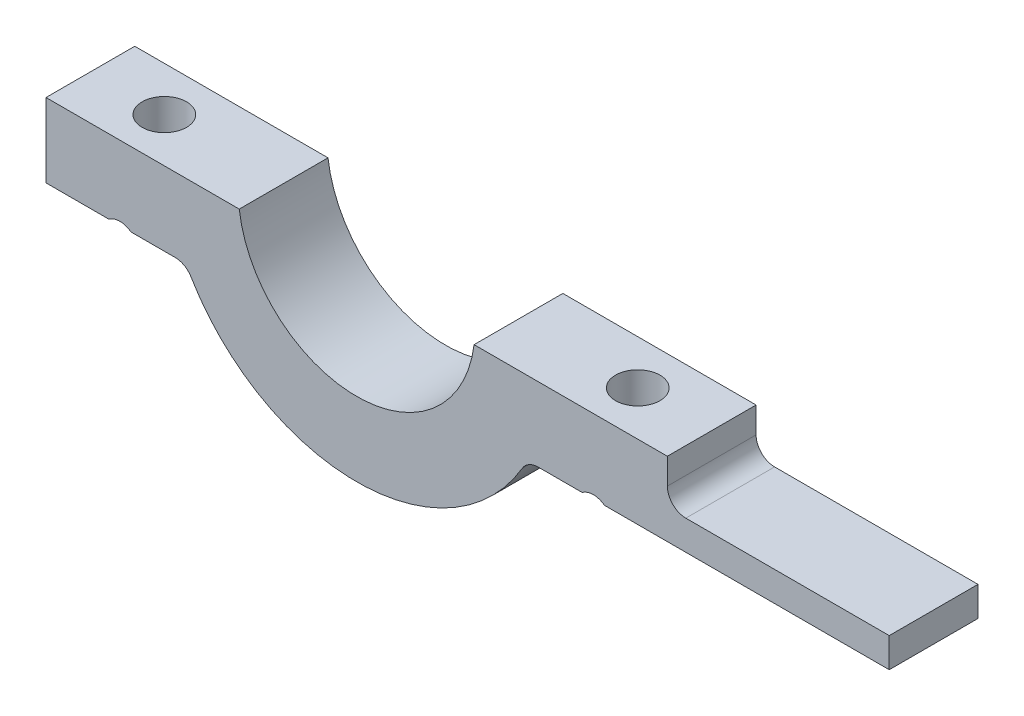
ISO-10303-21;
HEADER;
FILE_DESCRIPTION(('STEP AP214'),'2;1');
FILE_NAME('part.step','',(''),(''),'','','');
FILE_SCHEMA(('AUTOMOTIVE_DESIGN { 1 0 10303 214 1 1 1 1 }'));
ENDSEC;
DATA;
#1=APPLICATION_CONTEXT('core data for automotive mechanical design processes');
#2=APPLICATION_PROTOCOL_DEFINITION('international standard','automotive_design',2000,#1);
#3=PRODUCT_CONTEXT('',#1,'mechanical');
#4=PRODUCT('Part','Part','',(#3));
#5=PRODUCT_RELATED_PRODUCT_CATEGORY('part','',(#4));
#6=PRODUCT_DEFINITION_FORMATION('','',#4);
#7=PRODUCT_DEFINITION_CONTEXT('part definition',#1,'design');
#8=PRODUCT_DEFINITION('design','',#6,#7);
#9=PRODUCT_DEFINITION_SHAPE('','',#8);
#10=(LENGTH_UNIT() NAMED_UNIT(*) SI_UNIT(.MILLI.,.METRE.));
#11=(NAMED_UNIT(*) PLANE_ANGLE_UNIT() SI_UNIT($,.RADIAN.));
#12=(NAMED_UNIT(*) SI_UNIT($,.STERADIAN.) SOLID_ANGLE_UNIT());
#13=UNCERTAINTY_MEASURE_WITH_UNIT(LENGTH_MEASURE(1.E-05),#10,'distance_accuracy_value','');
#14=(GEOMETRIC_REPRESENTATION_CONTEXT(3) GLOBAL_UNCERTAINTY_ASSIGNED_CONTEXT((#13)) GLOBAL_UNIT_ASSIGNED_CONTEXT((#10,
#11,#12)) REPRESENTATION_CONTEXT('',''));
#15=CARTESIAN_POINT('',(0.,0.,0.));
#16=DIRECTION('',(0.,0.,1.));
#17=DIRECTION('',(1.,0.,0.));
#18=AXIS2_PLACEMENT_3D('',#15,#16,#17);
#19=CARTESIAN_POINT('',(16.,-7.,3.));
#20=DIRECTION('',(0.,0.,-1.));
#21=DIRECTION('',(-1.,0.,0.));
#22=AXIS2_PLACEMENT_3D('',#19,#20,#21);
#23=CYLINDRICAL_SURFACE('',#22,1.25);
#24=DIRECTION('',(0.,0.,-1.));
#25=VECTOR('',#24,1.);
#26=CARTESIAN_POINT('',(16.75,-6.,3.));
#27=LINE('',#26,#25);
#28=CARTESIAN_POINT('',(16.75,-6.,-1.29903810567665));
#29=VERTEX_POINT('',#28);
#30=CARTESIAN_POINT('',(16.75,-6.,-3.));
#31=VERTEX_POINT('',#30);
#32=EDGE_CURVE('E237',#29,#31,#27,.T.);
#33=ORIENTED_EDGE('',*,*,#32,.F.);
#34=CARTESIAN_POINT('',(16.75,-6.,-1.29903810567665));
#35=CARTESIAN_POINT('',(16.7034523990835,-5.96505773759994,-1.3259637600243));
#36=CARTESIAN_POINT('',(16.6536803872957,-5.93284701140208,-1.35130751097385));
#37=CARTESIAN_POINT('',(16.5480263148139,-5.87491645200976,-1.39749235477212));
#38=CARTESIAN_POINT('',(16.4920993025307,-5.8492496291699,-1.41829648962166));
#39=CARTESIAN_POINT('',(16.3748736403689,-5.80589259637046,-1.45369899215834));
#40=CARTESIAN_POINT('',(16.3135443763136,-5.78825187196965,-1.46825882938237));
#41=CARTESIAN_POINT('',(16.187803753275,-5.76253392775033,-1.48955289888847));
#42=CARTESIAN_POINT('',(16.1234054666696,-5.75441936271169,-1.49631768800948));
#43=CARTESIAN_POINT('',(16.0015030271869,-5.74869151482896,-1.50109033477879));
#44=CARTESIAN_POINT('',(15.944085875955,-5.74994812580208,-1.50004060489498));
#45=CARTESIAN_POINT('',(15.8304119342341,-5.76024289315279,-1.49147218328509));
#46=CARTESIAN_POINT('',(15.7741559843428,-5.76928649731826,-1.48394896270121));
#47=CARTESIAN_POINT('',(15.6669000244321,-5.79399700567411,-1.4635223484774));
#48=CARTESIAN_POINT('',(15.615777559287,-5.80935223027445,-1.45087248377396));
#49=CARTESIAN_POINT('',(15.5170371491128,-5.84586853244919,-1.4210588648522));
#50=CARTESIAN_POINT('',(15.4694210378669,-5.86703262102421,-1.4038927698564));
#51=CARTESIAN_POINT('',(15.3928862810774,-5.90677749716897,-1.37205772028725));
#52=CARTESIAN_POINT('',(15.3628537191617,-5.92402390487049,-1.3583427136007));
#53=CARTESIAN_POINT('',(15.3048796017577,-5.96054102676911,-1.32960548334226));
#54=CARTESIAN_POINT('',(15.2769309005037,-5.97980422150884,-1.31458814902116));
#55=CARTESIAN_POINT('',(15.25,-5.99999999999997,-1.29903810567669));
#56=B_SPLINE_CURVE_WITH_KNOTS('',3,(#34,#35,#36,#37,#38,#39,#40,#41,#42,#43,#44,#45,#46,#47,#48,
#49,#50,#51,#52,#53,#54,#55),.UNSPECIFIED.,.F.,.F.,(4,2,2,2,2,2,2,2,2,2,4),(0.,
0.192524806168671,0.386562911512205,0.581781680161196,0.77623255330663,0.947648909029573,
1.11918528532624,1.283110600635,1.44712104694824,1.55874051445253,1.66995771337883),.UNSPECIFIED.);
#57=CARTESIAN_POINT('',(15.25,-5.99999999999997,-1.29903810567669));
#58=VERTEX_POINT('',#57);
#59=EDGE_CURVE('E288',#29,#58,#56,.T.);
#60=ORIENTED_EDGE('',*,*,#59,.T.);
#61=DIRECTION('',(0.,0.,-1.));
#62=VECTOR('',#61,1.);
#63=CARTESIAN_POINT('',(15.25,-6.,3.));
#64=LINE('',#63,#62);
#65=CARTESIAN_POINT('',(15.25,-6.,-3.));
#66=VERTEX_POINT('',#65);
#67=EDGE_CURVE('E241',#58,#66,#64,.T.);
#68=ORIENTED_EDGE('',*,*,#67,.T.);
#69=CARTESIAN_POINT('',(16.,-7.,-3.));
#70=DIRECTION('',(0.,0.,1.));
#71=DIRECTION('',(1.,0.,0.));
#72=AXIS2_PLACEMENT_3D('',#69,#70,#71);
#73=CIRCLE('',#72,1.25);
#74=EDGE_CURVE('E341',#66,#31,#73,.F.);
#75=ORIENTED_EDGE('',*,*,#74,.T.);
#76=EDGE_LOOP('',(#33,#60,#68,#75));
#77=FACE_BOUND('',#76,.T.);
#78=ADVANCED_FACE('F35',(#77),#23,.F.);
#79=CARTESIAN_POINT('',(-16.,-7.,3.));
#80=DIRECTION('',(0.,0.,-1.));
#81=DIRECTION('',(-1.,0.,0.));
#82=AXIS2_PLACEMENT_3D('',#79,#80,#81);
#83=CYLINDRICAL_SURFACE('',#82,1.25);
#84=CARTESIAN_POINT('',(-15.25,-6.,1.29903810567665));
#85=CARTESIAN_POINT('',(-15.2965476009165,-5.96505773759994,1.3259637600243));
#86=CARTESIAN_POINT('',(-15.3463196127043,-5.93284701140209,1.35130751097384));
#87=CARTESIAN_POINT('',(-15.4519736851861,-5.87491645200976,1.39749235477212));
#88=CARTESIAN_POINT('',(-15.5079006974693,-5.8492496291699,1.41829648962166));
#89=CARTESIAN_POINT('',(-15.6251263596311,-5.80589259637046,1.45369899215833));
#90=CARTESIAN_POINT('',(-15.6864556236864,-5.78825187196965,1.46825882938237));
#91=CARTESIAN_POINT('',(-15.812196246725,-5.76253392775033,1.48955289888847));
#92=CARTESIAN_POINT('',(-15.8765945333304,-5.75441936271169,1.49631768800948));
#93=CARTESIAN_POINT('',(-15.9984969728131,-5.74869151482896,1.50109033477879));
#94=CARTESIAN_POINT('',(-16.055914124045,-5.74994812580208,1.50004060489498));
#95=CARTESIAN_POINT('',(-16.1695880657659,-5.76024289315279,1.49147218328509));
#96=CARTESIAN_POINT('',(-16.2258440156572,-5.76928649731826,1.48394896270121));
#97=CARTESIAN_POINT('',(-16.3330999755679,-5.79399700567412,1.4635223484774));
#98=CARTESIAN_POINT('',(-16.384222440713,-5.80935223027445,1.45087248377396));
#99=CARTESIAN_POINT('',(-16.4829628508872,-5.84586853244919,1.4210588648522));
#100=CARTESIAN_POINT('',(-16.5305789621331,-5.86703262102422,1.4038927698564));
#101=CARTESIAN_POINT('',(-16.6071137189227,-5.90677749716897,1.37205772028725));
#102=CARTESIAN_POINT('',(-16.6371462808383,-5.9240239048705,1.3583427136007));
#103=CARTESIAN_POINT('',(-16.6951203982423,-5.96054102676912,1.32960548334225));
#104=CARTESIAN_POINT('',(-16.7230690994963,-5.97980422150886,1.31458814902114));
#105=CARTESIAN_POINT('',(-16.75,-6.,1.29903810567667));
#106=B_SPLINE_CURVE_WITH_KNOTS('',3,(#84,#85,#86,#87,#88,#89,#90,#91,#92,#93,#94,#95,#96,#97,
#98,#99,#100,#101,#102,#103,#104,#105),.UNSPECIFIED.,.F.,.F.,(4,2,2,2,2,2,2,2,2,2,4),(0.,
0.192524806168674,0.386562911512207,0.581781680161196,0.77623255330663,0.947648909029573,
1.11918528532624,1.283110600635,1.44712104694824,1.55874051445255,1.66995771337888),.UNSPECIFIED.);
#107=CARTESIAN_POINT('',(-15.25,-6.00000000000003,1.29903810567662));
#108=VERTEX_POINT('',#107);
#109=CARTESIAN_POINT('',(-16.75,-6.00000000000003,1.29903810567664));
#110=VERTEX_POINT('',#109);
#111=EDGE_CURVE('E253',#108,#110,#106,.T.);
#112=ORIENTED_EDGE('',*,*,#111,.F.);
#113=DIRECTION('',(0.,0.,-1.));
#114=VECTOR('',#113,1.);
#115=CARTESIAN_POINT('',(-15.25,-6.,3.));
#116=LINE('',#115,#114);
#117=CARTESIAN_POINT('',(-15.25,-6.,3.));
#118=VERTEX_POINT('',#117);
#119=EDGE_CURVE('E217',#118,#108,#116,.T.);
#120=ORIENTED_EDGE('',*,*,#119,.F.);
#121=CARTESIAN_POINT('',(-16.,-7.,3.));
#122=DIRECTION('',(0.,0.,1.));
#123=DIRECTION('',(1.,0.,0.));
#124=AXIS2_PLACEMENT_3D('',#121,#122,#123);
#125=CIRCLE('',#124,1.25);
#126=CARTESIAN_POINT('',(-16.75,-6.,3.));
#127=VERTEX_POINT('',#126);
#128=EDGE_CURVE('E397',#118,#127,#125,.T.);
#129=ORIENTED_EDGE('',*,*,#128,.T.);
#130=DIRECTION('',(0.,0.,-1.));
#131=VECTOR('',#130,1.);
#132=CARTESIAN_POINT('',(-16.75,-6.,3.));
#133=LINE('',#132,#131);
#134=EDGE_CURVE('E222',#127,#110,#133,.T.);
#135=ORIENTED_EDGE('',*,*,#134,.T.);
#136=EDGE_LOOP('',(#112,#120,#129,#135));
#137=FACE_BOUND('',#136,.T.);
#138=ADVANCED_FACE('F317',(#137),#83,.F.);
#139=CARTESIAN_POINT('',(0.,-6.,3.));
#140=DIRECTION('',(0.,1.,0.));
#141=DIRECTION('',(0.,0.,1.));
#142=AXIS2_PLACEMENT_3D('',#139,#140,#141);
#143=PLANE('',#142);
#144=DIRECTION('',(1.,0.,0.));
#145=VECTOR('',#144,1.);
#146=CARTESIAN_POINT('',(0.,-6.,-3.));
#147=LINE('',#146,#145);
#148=CARTESIAN_POINT('',(-15.25,-6.,-3.));
#149=VERTEX_POINT('',#148);
#150=CARTESIAN_POINT('',(-12.2678441463853,-6.,-3.));
#151=VERTEX_POINT('',#150);
#152=EDGE_CURVE('E295',#149,#151,#147,.T.);
#153=ORIENTED_EDGE('',*,*,#152,.T.);
#154=DIRECTION('',(0.,0.,1.));
#155=VECTOR('',#154,1.);
#156=CARTESIAN_POINT('',(-12.2678441463853,-6.,3.));
#157=LINE('',#156,#155);
#158=CARTESIAN_POINT('',(-12.2678441463853,-6.,3.));
#159=VERTEX_POINT('',#158);
#160=EDGE_CURVE('E425',#151,#159,#157,.T.);
#161=ORIENTED_EDGE('',*,*,#160,.T.);
#162=DIRECTION('',(1.,0.,0.));
#163=VECTOR('',#162,1.);
#164=CARTESIAN_POINT('',(0.,-6.,3.));
#165=LINE('',#164,#163);
#166=EDGE_CURVE('E216',#118,#159,#165,.T.);
#167=ORIENTED_EDGE('',*,*,#166,.F.);
#168=ORIENTED_EDGE('',*,*,#119,.T.);
#169=CARTESIAN_POINT('',(-16.,-6.00000000000003,0.));
#170=DIRECTION('',(0.,-1.,0.));
#171=DIRECTION('',(1.,0.,0.));
#172=AXIS2_PLACEMENT_3D('',#169,#170,#171);
#173=CIRCLE('',#172,1.5);
#174=CARTESIAN_POINT('',(-15.25,-6.00000000000003,-1.29903810567662));
#175=VERTEX_POINT('',#174);
#176=EDGE_CURVE('E358',#175,#108,#173,.T.);
#177=ORIENTED_EDGE('',*,*,#176,.F.);
#178=EDGE_CURVE('E221',#175,#149,#116,.T.);
#179=ORIENTED_EDGE('',*,*,#178,.T.);
#180=EDGE_LOOP('',(#153,#161,#167,#168,#177,#179));
#181=FACE_BOUND('',#180,.T.);
#182=ADVANCED_FACE('F313',(#181),#143,.F.);
#183=CARTESIAN_POINT('',(0.,0.,3.));
#184=DIRECTION('',(0.,0.,-1.));
#185=DIRECTION('',(-1.,0.,0.));
#186=AXIS2_PLACEMENT_3D('',#183,#184,#185);
#187=CYLINDRICAL_SURFACE('',#186,13.);
#188=CARTESIAN_POINT('',(0.,0.,3.));
#189=DIRECTION('',(0.,0.,1.));
#190=DIRECTION('',(1.,0.,0.));
#191=AXIS2_PLACEMENT_3D('',#188,#189,#190);
#192=CIRCLE('',#191,13.);
#193=CARTESIAN_POINT('',(-11.1917174668778,-6.6140350877193,3.));
#194=VERTEX_POINT('',#193);
#195=CARTESIAN_POINT('',(11.1917174668778,-6.6140350877193,3.));
#196=VERTEX_POINT('',#195);
#197=EDGE_CURVE('E437',#194,#196,#192,.T.);
#198=ORIENTED_EDGE('',*,*,#197,.F.);
#199=DIRECTION('',(0.,0.,-1.));
#200=VECTOR('',#199,1.);
#201=CARTESIAN_POINT('',(-11.1917174668778,-6.6140350877193,3.));
#202=LINE('',#201,#200);
#203=CARTESIAN_POINT('',(-11.1917174668778,-6.6140350877193,-3.));
#204=VERTEX_POINT('',#203);
#205=EDGE_CURVE('E424',#194,#204,#202,.T.);
#206=ORIENTED_EDGE('',*,*,#205,.T.);
#207=CARTESIAN_POINT('',(0.,0.,-3.));
#208=DIRECTION('',(0.,0.,1.));
#209=DIRECTION('',(1.,0.,0.));
#210=AXIS2_PLACEMENT_3D('',#207,#208,#209);
#211=CIRCLE('',#210,13.);
#212=CARTESIAN_POINT('',(11.1917174668778,-6.6140350877193,-3.));
#213=VERTEX_POINT('',#212);
#214=EDGE_CURVE('E402',#204,#213,#211,.T.);
#215=ORIENTED_EDGE('',*,*,#214,.T.);
#216=DIRECTION('',(0.,0.,-1.));
#217=VECTOR('',#216,1.);
#218=CARTESIAN_POINT('',(11.1917174668778,-6.6140350877193,3.));
#219=LINE('',#218,#217);
#220=EDGE_CURVE('E421',#213,#196,#219,.F.);
#221=ORIENTED_EDGE('',*,*,#220,.T.);
#222=EDGE_LOOP('',(#198,#206,#215,#221));
#223=FACE_BOUND('',#222,.T.);
#224=ADVANCED_FACE('F309',(#223),#187,.T.);
#225=CARTESIAN_POINT('',(0.,-6.,3.));
#226=DIRECTION('',(0.,1.,0.));
#227=DIRECTION('',(-1.,0.,0.));
#228=AXIS2_PLACEMENT_3D('',#225,#226,#227);
#229=PLANE('',#228);
#230=DIRECTION('',(1.,0.,0.));
#231=VECTOR('',#230,1.);
#232=CARTESIAN_POINT('',(0.,-6.,3.));
#233=LINE('',#232,#231);
#234=CARTESIAN_POINT('',(12.2678441463853,-6.,3.));
#235=VERTEX_POINT('',#234);
#236=CARTESIAN_POINT('',(15.25,-6.,3.));
#237=VERTEX_POINT('',#236);
#238=EDGE_CURVE('E382',#235,#237,#233,.T.);
#239=ORIENTED_EDGE('',*,*,#238,.F.);
#240=DIRECTION('',(0.,0.,1.));
#241=VECTOR('',#240,1.);
#242=CARTESIAN_POINT('',(12.2678441463853,-6.,-3.));
#243=LINE('',#242,#241);
#244=CARTESIAN_POINT('',(12.2678441463853,-6.,-3.));
#245=VERTEX_POINT('',#244);
#246=EDGE_CURVE('E412',#235,#245,#243,.F.);
#247=ORIENTED_EDGE('',*,*,#246,.T.);
#248=DIRECTION('',(1.,0.,0.));
#249=VECTOR('',#248,1.);
#250=CARTESIAN_POINT('',(0.,-6.,-3.));
#251=LINE('',#250,#249);
#252=EDGE_CURVE('E405',#245,#66,#251,.T.);
#253=ORIENTED_EDGE('',*,*,#252,.T.);
#254=ORIENTED_EDGE('',*,*,#67,.F.);
#255=CARTESIAN_POINT('',(16.,-5.99999999999997,0.));
#256=DIRECTION('',(0.,-1.,0.));
#257=DIRECTION('',(1.,0.,0.));
#258=AXIS2_PLACEMENT_3D('',#255,#256,#257);
#259=CIRCLE('',#258,1.5);
#260=CARTESIAN_POINT('',(15.25,-5.99999999999997,1.29903810567669));
#261=VERTEX_POINT('',#260);
#262=EDGE_CURVE('E351',#261,#58,#259,.T.);
#263=ORIENTED_EDGE('',*,*,#262,.F.);
#264=EDGE_CURVE('E242',#237,#261,#64,.T.);
#265=ORIENTED_EDGE('',*,*,#264,.F.);
#266=EDGE_LOOP('',(#239,#247,#253,#254,#263,#265));
#267=FACE_BOUND('',#266,.T.);
#268=ADVANCED_FACE('F303',(#267),#229,.F.);
#269=ORIENTED_EDGE('',*,*,#264,.T.);
#270=CARTESIAN_POINT('',(15.25,-6.,1.29903810567667));
#271=CARTESIAN_POINT('',(15.2965476009165,-5.96505773759994,1.32596376002432));
#272=CARTESIAN_POINT('',(15.3463196127043,-5.93284701140208,1.35130751097386));
#273=CARTESIAN_POINT('',(15.4519736851861,-5.87491645200976,1.39749235477213));
#274=CARTESIAN_POINT('',(15.5079006974693,-5.8492496291699,1.41829648962167));
#275=CARTESIAN_POINT('',(15.6251263596311,-5.80589259637046,1.45369899215834));
#276=CARTESIAN_POINT('',(15.6864556236864,-5.78825187196965,1.46825882938237));
#277=CARTESIAN_POINT('',(15.812196246725,-5.76253392775033,1.48955289888848));
#278=CARTESIAN_POINT('',(15.8765945333304,-5.75441936271169,1.49631768800948));
#279=CARTESIAN_POINT('',(15.9984969728131,-5.74869151482896,1.50109033477879));
#280=CARTESIAN_POINT('',(16.055914124045,-5.74994812580208,1.50004060489498));
#281=CARTESIAN_POINT('',(16.1695880657659,-5.76024289315279,1.49147218328509));
#282=CARTESIAN_POINT('',(16.2258440156572,-5.76928649731826,1.4839489627012));
#283=CARTESIAN_POINT('',(16.3330999755679,-5.79399700567411,1.46352234847739));
#284=CARTESIAN_POINT('',(16.384222440713,-5.80935223027445,1.45087248377395));
#285=CARTESIAN_POINT('',(16.4829628508872,-5.84586853244918,1.42105886485219));
#286=CARTESIAN_POINT('',(16.5305789621331,-5.86703262102421,1.40389276985639));
#287=CARTESIAN_POINT('',(16.6071137189226,-5.90677749716896,1.37205772028724));
#288=CARTESIAN_POINT('',(16.6371462808383,-5.92402390487048,1.35834271360069));
#289=CARTESIAN_POINT('',(16.6951203982423,-5.9605410267691,1.32960548334225));
#290=CARTESIAN_POINT('',(16.7230690994963,-5.97980422150883,1.31458814902115));
#291=CARTESIAN_POINT('',(16.75,-5.99999999999996,1.29903810567667));
#292=B_SPLINE_CURVE_WITH_KNOTS('',3,(#270,#271,#272,#273,#274,#275,#276,#277,#278,#279,#280,
#281,#282,#283,#284,#285,#286,#287,#288,#289,#290,#291),.UNSPECIFIED.,.F.,.F.,(4,2,2,2,2,2,2,2,
2,2,4),(0.,0.192524806168671,0.386562911512203,0.581781680161193,0.776232553306623,
0.947648909029566,1.11918528532623,1.28311060063499,1.44712104694823,1.55874051445252,
1.66995771337882),.UNSPECIFIED.);
#293=CARTESIAN_POINT('',(16.75,-5.99999999999997,1.29903810567665));
#294=VERTEX_POINT('',#293);
#295=EDGE_CURVE('E280',#261,#294,#292,.T.);
#296=ORIENTED_EDGE('',*,*,#295,.T.);
#297=CARTESIAN_POINT('',(16.75,-6.,3.));
#298=VERTEX_POINT('',#297);
#299=EDGE_CURVE('E238',#298,#294,#27,.T.);
#300=ORIENTED_EDGE('',*,*,#299,.F.);
#301=CARTESIAN_POINT('',(16.,-7.,3.));
#302=DIRECTION('',(0.,0.,1.));
#303=DIRECTION('',(1.,0.,0.));
#304=AXIS2_PLACEMENT_3D('',#301,#302,#303);
#305=CIRCLE('',#304,1.25);
#306=EDGE_CURVE('E379',#237,#298,#305,.F.);
#307=ORIENTED_EDGE('',*,*,#306,.F.);
#308=EDGE_LOOP('',(#269,#296,#300,#307));
#309=FACE_BOUND('',#308,.T.);
#310=ADVANCED_FACE('F297',(#309),#23,.F.);
#311=CARTESIAN_POINT('',(0.,-5.99999999999999,3.));
#312=DIRECTION('',(0.,1.,0.));
#313=DIRECTION('',(-1.,0.,0.));
#314=AXIS2_PLACEMENT_3D('',#311,#312,#313);
#315=PLANE('',#314);
#316=ORIENTED_EDGE('',*,*,#299,.T.);
#317=EDGE_CURVE('E346',#29,#294,#259,.T.);
#318=ORIENTED_EDGE('',*,*,#317,.F.);
#319=ORIENTED_EDGE('',*,*,#32,.T.);
#320=DIRECTION('',(1.,0.,0.));
#321=VECTOR('',#320,1.);
#322=CARTESIAN_POINT('',(0.,-5.99999999999999,-3.));
#323=LINE('',#322,#321);
#324=CARTESIAN_POINT('',(36.,-6.,-3.));
#325=VERTEX_POINT('',#324);
#326=EDGE_CURVE('E203',#31,#325,#323,.T.);
#327=ORIENTED_EDGE('',*,*,#326,.T.);
#328=DIRECTION('',(0.,0.,-1.));
#329=VECTOR('',#328,1.);
#330=CARTESIAN_POINT('',(36.,-6.,3.));
#331=LINE('',#330,#329);
#332=CARTESIAN_POINT('',(36.,-6.,3.));
#333=VERTEX_POINT('',#332);
#334=EDGE_CURVE('E234',#333,#325,#331,.T.);
#335=ORIENTED_EDGE('',*,*,#334,.F.);
#336=DIRECTION('',(1.,0.,0.));
#337=VECTOR('',#336,1.);
#338=CARTESIAN_POINT('',(0.,-5.99999999999999,3.));
#339=LINE('',#338,#337);
#340=EDGE_CURVE('E378',#298,#333,#339,.T.);
#341=ORIENTED_EDGE('',*,*,#340,.F.);
#342=EDGE_LOOP('',(#316,#318,#319,#327,#335,#341));
#343=FACE_BOUND('',#342,.T.);
#344=ADVANCED_FACE('F302',(#343),#315,.F.);
#345=CARTESIAN_POINT('',(36.,0.,3.));
#346=DIRECTION('',(-1.,0.,0.));
#347=DIRECTION('',(0.,0.,1.));
#348=AXIS2_PLACEMENT_3D('',#345,#346,#347);
#349=PLANE('',#348);
#350=DIRECTION('',(0.,1.,0.));
#351=VECTOR('',#350,1.);
#352=CARTESIAN_POINT('',(36.,0.,-3.));
#353=LINE('',#352,#351);
#354=CARTESIAN_POINT('',(36.,-4.,-3.));
#355=VERTEX_POINT('',#354);
#356=EDGE_CURVE('E198',#325,#355,#353,.T.);
#357=ORIENTED_EDGE('',*,*,#356,.T.);
#358=DIRECTION('',(0.,0.,1.));
#359=VECTOR('',#358,1.);
#360=CARTESIAN_POINT('',(36.,-4.,-3.));
#361=LINE('',#360,#359);
#362=CARTESIAN_POINT('',(36.,-4.,3.));
#363=VERTEX_POINT('',#362);
#364=EDGE_CURVE('E191',#355,#363,#361,.T.);
#365=ORIENTED_EDGE('',*,*,#364,.T.);
#366=DIRECTION('',(0.,1.,0.));
#367=VECTOR('',#366,1.);
#368=CARTESIAN_POINT('',(36.,0.,3.));
#369=LINE('',#368,#367);
#370=EDGE_CURVE('E377',#333,#363,#369,.T.);
#371=ORIENTED_EDGE('',*,*,#370,.F.);
#372=ORIENTED_EDGE('',*,*,#334,.T.);
#373=EDGE_LOOP('',(#357,#365,#371,#372));
#374=FACE_BOUND('',#373,.T.);
#375=ADVANCED_FACE('F376',(#374),#349,.F.);
#376=CARTESIAN_POINT('',(0.,-0.999999999999998,3.));
#377=DIRECTION('',(0.,-1.,0.));
#378=DIRECTION('',(1.,0.,0.));
#379=AXIS2_PLACEMENT_3D('',#376,#377,#378);
#380=PLANE('',#379);
#381=CARTESIAN_POINT('',(16.,-0.999999999999922,0.));
#382=DIRECTION('',(0.,-1.,0.));
#383=DIRECTION('',(1.,0.,0.));
#384=AXIS2_PLACEMENT_3D('',#381,#382,#383);
#385=CIRCLE('',#384,1.5);
#386=CARTESIAN_POINT('',(17.5,-0.999999999999919,0.));
#387=VERTEX_POINT('',#386);
#388=EDGE_CURVE('E352',#387,#387,#385,.T.);
#389=ORIENTED_EDGE('',*,*,#388,.T.);
#390=EDGE_LOOP('',(#389));
#391=FACE_BOUND('',#390,.T.);
#392=DIRECTION('',(-1.,0.,0.));
#393=VECTOR('',#392,1.);
#394=CARTESIAN_POINT('',(0.,-0.999999999999998,3.));
#395=LINE('',#394,#393);
#396=CARTESIAN_POINT('',(21.,-1.,3.));
#397=VERTEX_POINT('',#396);
#398=CARTESIAN_POINT('',(7.93725393319377,-0.999999999999998,3.));
#399=VERTEX_POINT('',#398);
#400=EDGE_CURVE('E190',#397,#399,#395,.T.);
#401=ORIENTED_EDGE('',*,*,#400,.F.);
#402=DIRECTION('',(0.,0.,1.));
#403=VECTOR('',#402,1.);
#404=CARTESIAN_POINT('',(21.,-1.,-3.));
#405=LINE('',#404,#403);
#406=CARTESIAN_POINT('',(21.,-1.,-3.));
#407=VERTEX_POINT('',#406);
#408=EDGE_CURVE('E177',#407,#397,#405,.T.);
#409=ORIENTED_EDGE('',*,*,#408,.F.);
#410=DIRECTION('',(-1.,0.,0.));
#411=VECTOR('',#410,1.);
#412=CARTESIAN_POINT('',(0.,-0.999999999999998,-3.));
#413=LINE('',#412,#411);
#414=CARTESIAN_POINT('',(7.93725393319377,-0.999999999999998,-3.));
#415=VERTEX_POINT('',#414);
#416=EDGE_CURVE('E188',#407,#415,#413,.T.);
#417=ORIENTED_EDGE('',*,*,#416,.T.);
#418=DIRECTION('',(0.,0.,-1.));
#419=VECTOR('',#418,1.);
#420=CARTESIAN_POINT('',(7.93725393319377,-0.999999999999998,3.));
#421=LINE('',#420,#419);
#422=EDGE_CURVE('E232',#399,#415,#421,.T.);
#423=ORIENTED_EDGE('',*,*,#422,.F.);
#424=EDGE_LOOP('',(#401,#409,#417,#423));
#425=FACE_BOUND('',#424,.T.);
#426=ADVANCED_FACE('F186',(#391,#425),#380,.F.);
#427=CARTESIAN_POINT('',(0.,0.,3.));
#428=DIRECTION('',(0.,0.,-1.));
#429=DIRECTION('',(-1.,0.,0.));
#430=AXIS2_PLACEMENT_3D('',#427,#428,#429);
#431=CYLINDRICAL_SURFACE('',#430,8.);
#432=CARTESIAN_POINT('',(0.,0.,-3.));
#433=DIRECTION('',(0.,0.,1.));
#434=DIRECTION('',(1.,0.,0.));
#435=AXIS2_PLACEMENT_3D('',#432,#433,#434);
#436=CIRCLE('',#435,8.);
#437=CARTESIAN_POINT('',(-7.93725393319377,-1.,-3.));
#438=VERTEX_POINT('',#437);
#439=EDGE_CURVE('E197',#438,#415,#436,.T.);
#440=ORIENTED_EDGE('',*,*,#439,.F.);
#441=DIRECTION('',(0.,0.,-1.));
#442=VECTOR('',#441,1.);
#443=CARTESIAN_POINT('',(-7.93725393319377,-1.,3.));
#444=LINE('',#443,#442);
#445=CARTESIAN_POINT('',(-7.93725393319377,-1.,3.));
#446=VERTEX_POINT('',#445);
#447=EDGE_CURVE('E230',#446,#438,#444,.T.);
#448=ORIENTED_EDGE('',*,*,#447,.F.);
#449=CARTESIAN_POINT('',(0.,0.,3.));
#450=DIRECTION('',(0.,0.,1.));
#451=DIRECTION('',(1.,0.,0.));
#452=AXIS2_PLACEMENT_3D('',#449,#450,#451);
#453=CIRCLE('',#452,8.);
#454=EDGE_CURVE('E387',#446,#399,#453,.T.);
#455=ORIENTED_EDGE('',*,*,#454,.T.);
#456=ORIENTED_EDGE('',*,*,#422,.T.);
#457=EDGE_LOOP('',(#440,#448,#455,#456));
#458=FACE_BOUND('',#457,.T.);
#459=ADVANCED_FACE('F468',(#458),#431,.F.);
#460=CARTESIAN_POINT('',(0.,-1.,3.));
#461=DIRECTION('',(0.,1.,0.));
#462=DIRECTION('',(0.,0.,1.));
#463=AXIS2_PLACEMENT_3D('',#460,#461,#462);
#464=PLANE('',#463);
#465=CARTESIAN_POINT('',(-16.,-0.999999999999988,0.));
#466=DIRECTION('',(0.,-1.,0.));
#467=DIRECTION('',(1.,0.,0.));
#468=AXIS2_PLACEMENT_3D('',#465,#466,#467);
#469=CIRCLE('',#468,1.5);
#470=CARTESIAN_POINT('',(-14.5,-0.999999999999985,0.));
#471=VERTEX_POINT('',#470);
#472=EDGE_CURVE('E361',#471,#471,#469,.T.);
#473=ORIENTED_EDGE('',*,*,#472,.T.);
#474=EDGE_LOOP('',(#473));
#475=FACE_BOUND('',#474,.T.);
#476=DIRECTION('',(1.,0.,0.));
#477=VECTOR('',#476,1.);
#478=CARTESIAN_POINT('',(0.,-1.,-3.));
#479=LINE('',#478,#477);
#480=CARTESIAN_POINT('',(-21.,-1.,-3.));
#481=VERTEX_POINT('',#480);
#482=EDGE_CURVE('E200',#481,#438,#479,.T.);
#483=ORIENTED_EDGE('',*,*,#482,.F.);
#484=DIRECTION('',(0.,0.,-1.));
#485=VECTOR('',#484,1.);
#486=CARTESIAN_POINT('',(-21.,-1.,3.));
#487=LINE('',#486,#485);
#488=CARTESIAN_POINT('',(-21.,-1.,3.));
#489=VERTEX_POINT('',#488);
#490=EDGE_CURVE('E228',#489,#481,#487,.T.);
#491=ORIENTED_EDGE('',*,*,#490,.F.);
#492=DIRECTION('',(1.,0.,0.));
#493=VECTOR('',#492,1.);
#494=CARTESIAN_POINT('',(0.,-1.,3.));
#495=LINE('',#494,#493);
#496=EDGE_CURVE('E390',#489,#446,#495,.T.);
#497=ORIENTED_EDGE('',*,*,#496,.T.);
#498=ORIENTED_EDGE('',*,*,#447,.T.);
#499=EDGE_LOOP('',(#483,#491,#497,#498));
#500=FACE_BOUND('',#499,.T.);
#501=ADVANCED_FACE('F465',(#475,#500),#464,.T.);
#502=CARTESIAN_POINT('',(-21.,0.,3.));
#503=DIRECTION('',(1.,0.,0.));
#504=DIRECTION('',(0.,1.,0.));
#505=AXIS2_PLACEMENT_3D('',#502,#503,#504);
#506=PLANE('',#505);
#507=DIRECTION('',(0.,-1.,0.));
#508=VECTOR('',#507,1.);
#509=CARTESIAN_POINT('',(-21.,0.,-3.));
#510=LINE('',#509,#508);
#511=CARTESIAN_POINT('',(-21.,-6.,-3.));
#512=VERTEX_POINT('',#511);
#513=EDGE_CURVE('E208',#481,#512,#510,.T.);
#514=ORIENTED_EDGE('',*,*,#513,.T.);
#515=DIRECTION('',(0.,0.,-1.));
#516=VECTOR('',#515,1.);
#517=CARTESIAN_POINT('',(-21.,-6.,3.));
#518=LINE('',#517,#516);
#519=CARTESIAN_POINT('',(-21.,-6.,3.));
#520=VERTEX_POINT('',#519);
#521=EDGE_CURVE('E225',#520,#512,#518,.T.);
#522=ORIENTED_EDGE('',*,*,#521,.F.);
#523=DIRECTION('',(0.,-1.,0.));
#524=VECTOR('',#523,1.);
#525=CARTESIAN_POINT('',(-21.,0.,3.));
#526=LINE('',#525,#524);
#527=EDGE_CURVE('E393',#489,#520,#526,.T.);
#528=ORIENTED_EDGE('',*,*,#527,.F.);
#529=ORIENTED_EDGE('',*,*,#490,.T.);
#530=EDGE_LOOP('',(#514,#522,#528,#529));
#531=FACE_BOUND('',#530,.T.);
#532=ADVANCED_FACE('F462',(#531),#506,.F.);
#533=CARTESIAN_POINT('',(0.,-6.,3.));
#534=DIRECTION('',(0.,1.,0.));
#535=DIRECTION('',(0.,0.,1.));
#536=AXIS2_PLACEMENT_3D('',#533,#534,#535);
#537=PLANE('',#536);
#538=CARTESIAN_POINT('',(-16.75,-6.,-1.29903810567664));
#539=VERTEX_POINT('',#538);
#540=CARTESIAN_POINT('',(-16.75,-6.,-3.));
#541=VERTEX_POINT('',#540);
#542=EDGE_CURVE('E220',#539,#541,#133,.T.);
#543=ORIENTED_EDGE('',*,*,#542,.F.);
#544=EDGE_CURVE('E360',#110,#539,#173,.T.);
#545=ORIENTED_EDGE('',*,*,#544,.F.);
#546=ORIENTED_EDGE('',*,*,#134,.F.);
#547=DIRECTION('',(1.,0.,0.));
#548=VECTOR('',#547,1.);
#549=CARTESIAN_POINT('',(0.,-6.,3.));
#550=LINE('',#549,#548);
#551=EDGE_CURVE('E395',#520,#127,#550,.T.);
#552=ORIENTED_EDGE('',*,*,#551,.F.);
#553=ORIENTED_EDGE('',*,*,#521,.T.);
#554=DIRECTION('',(1.,0.,0.));
#555=VECTOR('',#554,1.);
#556=CARTESIAN_POINT('',(0.,-6.,-3.));
#557=LINE('',#556,#555);
#558=EDGE_CURVE('E210',#512,#541,#557,.T.);
#559=ORIENTED_EDGE('',*,*,#558,.T.);
#560=EDGE_LOOP('',(#543,#545,#546,#552,#553,#559));
#561=FACE_BOUND('',#560,.T.);
#562=ADVANCED_FACE('F455',(#561),#537,.F.);
#563=CARTESIAN_POINT('',(-16.75,-6.,-1.29903810567667));
#564=CARTESIAN_POINT('',(-16.7034523990835,-5.96505773759994,-1.32596376002432));
#565=CARTESIAN_POINT('',(-16.6536803872957,-5.93284701140209,-1.35130751097386));
#566=CARTESIAN_POINT('',(-16.5480263148139,-5.87491645200976,-1.39749235477213));
#567=CARTESIAN_POINT('',(-16.4920993025307,-5.84924962916991,-1.41829648962167));
#568=CARTESIAN_POINT('',(-16.3748736403689,-5.80589259637046,-1.45369899215834));
#569=CARTESIAN_POINT('',(-16.3135443763136,-5.78825187196965,-1.46825882938237));
#570=CARTESIAN_POINT('',(-16.187803753275,-5.76253392775033,-1.48955289888848));
#571=CARTESIAN_POINT('',(-16.1234054666696,-5.75441936271169,-1.49631768800948));
#572=CARTESIAN_POINT('',(-16.0015030271869,-5.74869151482896,-1.50109033477879));
#573=CARTESIAN_POINT('',(-15.944085875955,-5.74994812580208,-1.50004060489498));
#574=CARTESIAN_POINT('',(-15.8304119342341,-5.76024289315279,-1.49147218328509));
#575=CARTESIAN_POINT('',(-15.7741559843428,-5.76928649731826,-1.48394896270121));
#576=CARTESIAN_POINT('',(-15.6669000244321,-5.79399700567411,-1.46352234847739));
#577=CARTESIAN_POINT('',(-15.615777559287,-5.80935223027445,-1.45087248377395));
#578=CARTESIAN_POINT('',(-15.5170371491128,-5.84586853244919,-1.42105886485219));
#579=CARTESIAN_POINT('',(-15.4694210378669,-5.86703262102421,-1.40389276985639));
#580=CARTESIAN_POINT('',(-15.3928862810774,-5.90677749716897,-1.37205772028724));
#581=CARTESIAN_POINT('',(-15.3628537191617,-5.9240239048705,-1.35834271360069));
#582=CARTESIAN_POINT('',(-15.3048796017577,-5.96054102676912,-1.32960548334223));
#583=CARTESIAN_POINT('',(-15.2769309005037,-5.97980422150886,-1.31458814902112));
#584=CARTESIAN_POINT('',(-15.25,-6.,-1.29903810567665));
#585=B_SPLINE_CURVE_WITH_KNOTS('',3,(#563,#564,#565,#566,#567,#568,#569,#570,#571,#572,#573,
#574,#575,#576,#577,#578,#579,#580,#581,#582,#583,#584),.UNSPECIFIED.,.F.,.F.,(4,2,2,2,2,2,2,2,
2,2,4),(0.,0.19252480616867,0.386562911512199,0.581781680161189,0.776232553306619,
0.947648909029562,1.11918528532623,1.28311060063499,1.44712104694822,1.55874051445255,
1.66995771337888),.UNSPECIFIED.);
#586=EDGE_CURVE('E245',#539,#175,#585,.T.);
#587=ORIENTED_EDGE('',*,*,#586,.F.);
#588=ORIENTED_EDGE('',*,*,#542,.T.);
#589=CARTESIAN_POINT('',(-16.,-7.,-3.));
#590=DIRECTION('',(0.,0.,1.));
#591=DIRECTION('',(1.,0.,0.));
#592=AXIS2_PLACEMENT_3D('',#589,#590,#591);
#593=CIRCLE('',#592,1.25);
#594=EDGE_CURVE('E213',#149,#541,#593,.T.);
#595=ORIENTED_EDGE('',*,*,#594,.F.);
#596=ORIENTED_EDGE('',*,*,#178,.F.);
#597=EDGE_LOOP('',(#587,#588,#595,#596));
#598=FACE_BOUND('',#597,.T.);
#599=ADVANCED_FACE('F259',(#598),#83,.F.);
#600=CARTESIAN_POINT('',(0.,0.,3.));
#601=DIRECTION('',(0.,0.,1.));
#602=DIRECTION('',(1.,0.,0.));
#603=AXIS2_PLACEMENT_3D('',#600,#601,#602);
#604=PLANE('',#603);
#605=DIRECTION('',(1.,0.,0.));
#606=VECTOR('',#605,1.);
#607=CARTESIAN_POINT('',(36.,-4.,3.));
#608=LINE('',#607,#606);
#609=CARTESIAN_POINT('',(22.25,-4.,3.));
#610=VERTEX_POINT('',#609);
#611=EDGE_CURVE('E182',#610,#363,#608,.T.);
#612=ORIENTED_EDGE('',*,*,#611,.F.);
#613=CARTESIAN_POINT('',(22.25,-2.75,3.));
#614=DIRECTION('',(0.,0.,1.));
#615=DIRECTION('',(1.,0.,0.));
#616=AXIS2_PLACEMENT_3D('',#613,#614,#615);
#617=CIRCLE('',#616,1.25);
#618=CARTESIAN_POINT('',(21.,-2.75,3.));
#619=VERTEX_POINT('',#618);
#620=EDGE_CURVE('E43',#610,#619,#617,.F.);
#621=ORIENTED_EDGE('',*,*,#620,.T.);
#622=DIRECTION('',(0.,-1.,0.));
#623=VECTOR('',#622,1.);
#624=CARTESIAN_POINT('',(21.,-1.,3.));
#625=LINE('',#624,#623);
#626=EDGE_CURVE('E365',#397,#619,#625,.T.);
#627=ORIENTED_EDGE('',*,*,#626,.F.);
#628=ORIENTED_EDGE('',*,*,#400,.T.);
#629=ORIENTED_EDGE('',*,*,#454,.F.);
#630=ORIENTED_EDGE('',*,*,#496,.F.);
#631=ORIENTED_EDGE('',*,*,#527,.T.);
#632=ORIENTED_EDGE('',*,*,#551,.T.);
#633=ORIENTED_EDGE('',*,*,#128,.F.);
#634=ORIENTED_EDGE('',*,*,#166,.T.);
#635=CARTESIAN_POINT('',(-12.2678441463853,-7.25,3.));
#636=DIRECTION('',(0.,0.,1.));
#637=DIRECTION('',(1.,0.,0.));
#638=AXIS2_PLACEMENT_3D('',#635,#636,#637);
#639=CIRCLE('',#638,1.25);
#640=EDGE_CURVE('E417',#159,#194,#639,.F.);
#641=ORIENTED_EDGE('',*,*,#640,.T.);
#642=ORIENTED_EDGE('',*,*,#197,.T.);
#643=CARTESIAN_POINT('',(12.2678441463853,-7.25,3.));
#644=DIRECTION('',(0.,0.,1.));
#645=DIRECTION('',(1.,0.,0.));
#646=AXIS2_PLACEMENT_3D('',#643,#644,#645);
#647=CIRCLE('',#646,1.25);
#648=EDGE_CURVE('E416',#196,#235,#647,.F.);
#649=ORIENTED_EDGE('',*,*,#648,.T.);
#650=ORIENTED_EDGE('',*,*,#238,.T.);
#651=ORIENTED_EDGE('',*,*,#306,.T.);
#652=ORIENTED_EDGE('',*,*,#340,.T.);
#653=ORIENTED_EDGE('',*,*,#370,.T.);
#654=EDGE_LOOP('',(#612,#621,#627,#628,#629,#630,#631,#632,#633,#634,#641,#642,#649,#650,#651,
#652,#653));
#655=FACE_BOUND('',#654,.T.);
#656=ADVANCED_FACE('F277',(#655),#604,.T.);
#657=CARTESIAN_POINT('',(0.,0.,-3.));
#658=DIRECTION('',(0.,0.,1.));
#659=DIRECTION('',(1.,0.,0.));
#660=AXIS2_PLACEMENT_3D('',#657,#658,#659);
#661=PLANE('',#660);
#662=DIRECTION('',(0.,-1.,0.));
#663=VECTOR('',#662,1.);
#664=CARTESIAN_POINT('',(21.,-1.,-3.));
#665=LINE('',#664,#663);
#666=CARTESIAN_POINT('',(21.,-2.75,-3.));
#667=VERTEX_POINT('',#666);
#668=EDGE_CURVE('E174',#407,#667,#665,.T.);
#669=ORIENTED_EDGE('',*,*,#668,.T.);
#670=CARTESIAN_POINT('',(22.25,-2.75,-3.));
#671=DIRECTION('',(0.,0.,1.));
#672=DIRECTION('',(1.,0.,0.));
#673=AXIS2_PLACEMENT_3D('',#670,#671,#672);
#674=CIRCLE('',#673,1.25);
#675=CARTESIAN_POINT('',(22.25,-4.,-3.));
#676=VERTEX_POINT('',#675);
#677=EDGE_CURVE('E11',#667,#676,#674,.T.);
#678=ORIENTED_EDGE('',*,*,#677,.T.);
#679=DIRECTION('',(1.,0.,0.));
#680=VECTOR('',#679,1.);
#681=CARTESIAN_POINT('',(36.,-4.,-3.));
#682=LINE('',#681,#680);
#683=EDGE_CURVE('E181',#676,#355,#682,.T.);
#684=ORIENTED_EDGE('',*,*,#683,.T.);
#685=ORIENTED_EDGE('',*,*,#356,.F.);
#686=ORIENTED_EDGE('',*,*,#326,.F.);
#687=ORIENTED_EDGE('',*,*,#74,.F.);
#688=ORIENTED_EDGE('',*,*,#252,.F.);
#689=CARTESIAN_POINT('',(12.2678441463853,-7.25,-3.));
#690=DIRECTION('',(0.,0.,1.));
#691=DIRECTION('',(1.,0.,0.));
#692=AXIS2_PLACEMENT_3D('',#689,#690,#691);
#693=CIRCLE('',#692,1.25);
#694=EDGE_CURVE('E414',#245,#213,#693,.T.);
#695=ORIENTED_EDGE('',*,*,#694,.T.);
#696=ORIENTED_EDGE('',*,*,#214,.F.);
#697=CARTESIAN_POINT('',(-12.2678441463853,-7.25,-3.));
#698=DIRECTION('',(0.,0.,1.));
#699=DIRECTION('',(1.,0.,0.));
#700=AXIS2_PLACEMENT_3D('',#697,#698,#699);
#701=CIRCLE('',#700,1.25);
#702=EDGE_CURVE('E433',#204,#151,#701,.T.);
#703=ORIENTED_EDGE('',*,*,#702,.T.);
#704=ORIENTED_EDGE('',*,*,#152,.F.);
#705=ORIENTED_EDGE('',*,*,#594,.T.);
#706=ORIENTED_EDGE('',*,*,#558,.F.);
#707=ORIENTED_EDGE('',*,*,#513,.F.);
#708=ORIENTED_EDGE('',*,*,#482,.T.);
#709=ORIENTED_EDGE('',*,*,#439,.T.);
#710=ORIENTED_EDGE('',*,*,#416,.F.);
#711=EDGE_LOOP('',(#669,#678,#684,#685,#686,#687,#688,#695,#696,#703,#704,#705,#706,#707,#708,
#709,#710));
#712=FACE_BOUND('',#711,.T.);
#713=ADVANCED_FACE('F194',(#712),#661,.F.);
#714=CARTESIAN_POINT('',(-16.,-0.999999999999988,0.));
#715=DIRECTION('',(0.,-1.,0.));
#716=DIRECTION('',(1.,0.,0.));
#717=AXIS2_PLACEMENT_3D('',#714,#715,#716);
#718=CYLINDRICAL_SURFACE('',#717,1.5);
#719=ORIENTED_EDGE('',*,*,#111,.T.);
#720=ORIENTED_EDGE('',*,*,#544,.T.);
#721=ORIENTED_EDGE('',*,*,#586,.T.);
#722=ORIENTED_EDGE('',*,*,#176,.T.);
#723=EDGE_LOOP('',(#719,#720,#721,#722));
#724=FACE_BOUND('',#723,.T.);
#725=ORIENTED_EDGE('',*,*,#472,.F.);
#726=EDGE_LOOP('',(#725));
#727=FACE_BOUND('',#726,.T.);
#728=ADVANCED_FACE('F263',(#724,#727),#718,.F.);
#729=CARTESIAN_POINT('',(16.,-0.999999999999922,0.));
#730=DIRECTION('',(0.,-1.,0.));
#731=DIRECTION('',(1.,0.,0.));
#732=AXIS2_PLACEMENT_3D('',#729,#730,#731);
#733=CYLINDRICAL_SURFACE('',#732,1.5);
#734=ORIENTED_EDGE('',*,*,#388,.F.);
#735=EDGE_LOOP('',(#734));
#736=FACE_BOUND('',#735,.T.);
#737=ORIENTED_EDGE('',*,*,#317,.T.);
#738=ORIENTED_EDGE('',*,*,#295,.F.);
#739=ORIENTED_EDGE('',*,*,#262,.T.);
#740=ORIENTED_EDGE('',*,*,#59,.F.);
#741=EDGE_LOOP('',(#737,#738,#739,#740));
#742=FACE_BOUND('',#741,.T.);
#743=ADVANCED_FACE('F268',(#736,#742),#733,.F.);
#744=CARTESIAN_POINT('',(36.,-4.,-3.));
#745=DIRECTION('',(0.,-1.,0.));
#746=DIRECTION('',(1.,0.,0.));
#747=AXIS2_PLACEMENT_3D('',#744,#745,#746);
#748=PLANE('',#747);
#749=ORIENTED_EDGE('',*,*,#683,.F.);
#750=DIRECTION('',(0.,0.,1.));
#751=VECTOR('',#750,1.);
#752=CARTESIAN_POINT('',(22.25,-4.,3.));
#753=LINE('',#752,#751);
#754=EDGE_CURVE('E430',#676,#610,#753,.T.);
#755=ORIENTED_EDGE('',*,*,#754,.T.);
#756=ORIENTED_EDGE('',*,*,#611,.T.);
#757=ORIENTED_EDGE('',*,*,#364,.F.);
#758=EDGE_LOOP('',(#749,#755,#756,#757));
#759=FACE_BOUND('',#758,.T.);
#760=ADVANCED_FACE('F275',(#759),#748,.F.);
#761=CARTESIAN_POINT('',(21.,-1.,-3.));
#762=DIRECTION('',(-1.,0.,0.));
#763=DIRECTION('',(0.,0.,1.));
#764=AXIS2_PLACEMENT_3D('',#761,#762,#763);
#765=PLANE('',#764);
#766=ORIENTED_EDGE('',*,*,#626,.T.);
#767=DIRECTION('',(0.,0.,1.));
#768=VECTOR('',#767,1.);
#769=CARTESIAN_POINT('',(21.,-2.75,-3.));
#770=LINE('',#769,#768);
#771=EDGE_CURVE('E50',#619,#667,#770,.F.);
#772=ORIENTED_EDGE('',*,*,#771,.T.);
#773=ORIENTED_EDGE('',*,*,#668,.F.);
#774=ORIENTED_EDGE('',*,*,#408,.T.);
#775=EDGE_LOOP('',(#766,#772,#773,#774));
#776=FACE_BOUND('',#775,.T.);
#777=ADVANCED_FACE('F176',(#776),#765,.F.);
#778=CARTESIAN_POINT('',(-12.2678441463853,-7.25,3.));
#779=DIRECTION('',(0.,0.,-1.));
#780=DIRECTION('',(-1.,0.,0.));
#781=AXIS2_PLACEMENT_3D('',#778,#779,#780);
#782=CYLINDRICAL_SURFACE('',#781,1.25);
#783=ORIENTED_EDGE('',*,*,#640,.F.);
#784=ORIENTED_EDGE('',*,*,#160,.F.);
#785=ORIENTED_EDGE('',*,*,#702,.F.);
#786=ORIENTED_EDGE('',*,*,#205,.F.);
#787=EDGE_LOOP('',(#783,#784,#785,#786));
#788=FACE_BOUND('',#787,.T.);
#789=ADVANCED_FACE('F319',(#788),#782,.F.);
#790=CARTESIAN_POINT('',(12.2678441463853,-7.25,3.));
#791=DIRECTION('',(0.,0.,-1.));
#792=DIRECTION('',(-1.,0.,0.));
#793=AXIS2_PLACEMENT_3D('',#790,#791,#792);
#794=CYLINDRICAL_SURFACE('',#793,1.25);
#795=ORIENTED_EDGE('',*,*,#648,.F.);
#796=ORIENTED_EDGE('',*,*,#220,.F.);
#797=ORIENTED_EDGE('',*,*,#694,.F.);
#798=ORIENTED_EDGE('',*,*,#246,.F.);
#799=EDGE_LOOP('',(#795,#796,#797,#798));
#800=FACE_BOUND('',#799,.T.);
#801=ADVANCED_FACE('F321',(#800),#794,.F.);
#802=CARTESIAN_POINT('',(22.25,-2.75,-3.));
#803=DIRECTION('',(0.,0.,-1.));
#804=DIRECTION('',(-1.,0.,0.));
#805=AXIS2_PLACEMENT_3D('',#802,#803,#804);
#806=CYLINDRICAL_SURFACE('',#805,1.25);
#807=ORIENTED_EDGE('',*,*,#677,.F.);
#808=ORIENTED_EDGE('',*,*,#771,.F.);
#809=ORIENTED_EDGE('',*,*,#620,.F.);
#810=ORIENTED_EDGE('',*,*,#754,.F.);
#811=EDGE_LOOP('',(#807,#808,#809,#810));
#812=FACE_BOUND('',#811,.T.);
#813=ADVANCED_FACE('F37',(#812),#806,.F.);
#814=CLOSED_SHELL('',(#78,#138,#182,#224,#268,#310,#344,#375,#426,#459,#501,#532,#562,#599,#656,
#713,#728,#743,#760,#777,#789,#801,#813));
#815=MANIFOLD_SOLID_BREP('B2',#814);
#816=ADVANCED_BREP_SHAPE_REPRESENTATION('',(#18,#815),#14);
#817=SHAPE_DEFINITION_REPRESENTATION(#9,#816);
ENDSEC;
END-ISO-10303-21;
